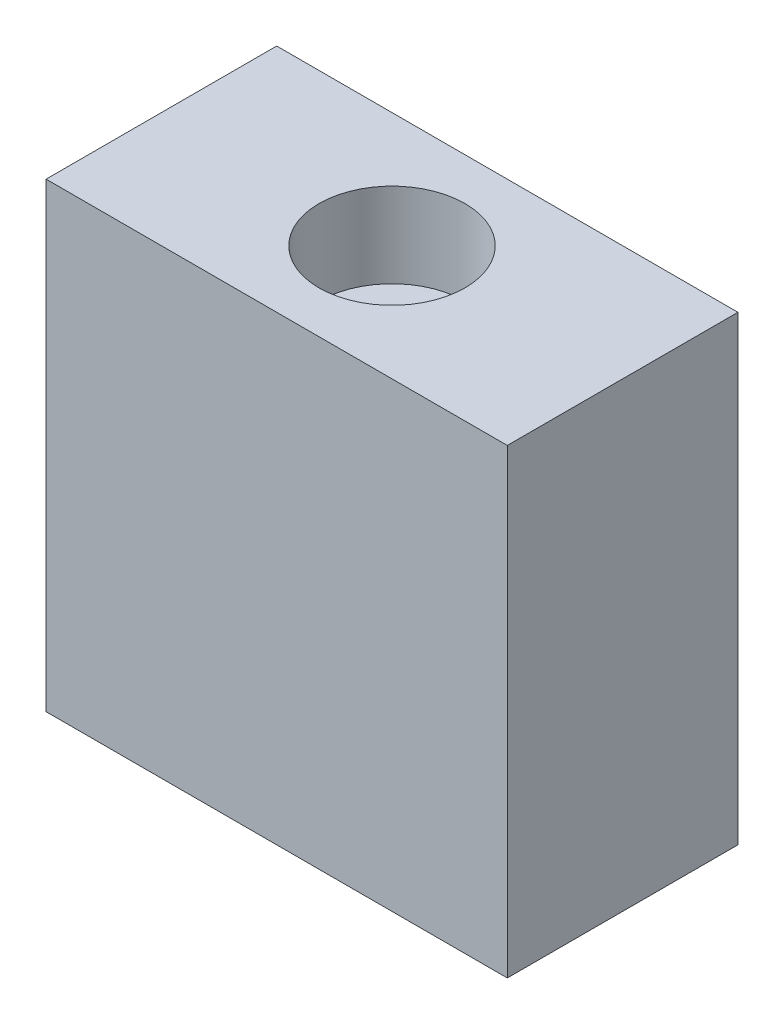
ISO-10303-21;
HEADER;
FILE_DESCRIPTION(('STEP AP214'),'2;1');
FILE_NAME('part.step','',(''),(''),'','','');
FILE_SCHEMA(('AUTOMOTIVE_DESIGN { 1 0 10303 214 1 1 1 1 }'));
ENDSEC;
DATA;
#1=APPLICATION_CONTEXT('core data for automotive mechanical design processes');
#2=APPLICATION_PROTOCOL_DEFINITION('international standard','automotive_design',2000,#1);
#3=PRODUCT_CONTEXT('',#1,'mechanical');
#4=PRODUCT('Part','Part','',(#3));
#5=PRODUCT_RELATED_PRODUCT_CATEGORY('part','',(#4));
#6=PRODUCT_DEFINITION_FORMATION('','',#4);
#7=PRODUCT_DEFINITION_CONTEXT('part definition',#1,'design');
#8=PRODUCT_DEFINITION('design','',#6,#7);
#9=PRODUCT_DEFINITION_SHAPE('','',#8);
#10=(LENGTH_UNIT() NAMED_UNIT(*) SI_UNIT(.MILLI.,.METRE.));
#11=(NAMED_UNIT(*) PLANE_ANGLE_UNIT() SI_UNIT($,.RADIAN.));
#12=(NAMED_UNIT(*) SI_UNIT($,.STERADIAN.) SOLID_ANGLE_UNIT());
#13=UNCERTAINTY_MEASURE_WITH_UNIT(LENGTH_MEASURE(1.E-05),#10,'distance_accuracy_value','');
#14=(GEOMETRIC_REPRESENTATION_CONTEXT(3) GLOBAL_UNCERTAINTY_ASSIGNED_CONTEXT((#13)) GLOBAL_UNIT_ASSIGNED_CONTEXT((#10,
#11,#12)) REPRESENTATION_CONTEXT('',''));
#15=CARTESIAN_POINT('',(0.,0.,0.));
#16=DIRECTION('',(0.,0.,1.));
#17=DIRECTION('',(1.,0.,0.));
#18=AXIS2_PLACEMENT_3D('',#15,#16,#17);
#19=CARTESIAN_POINT('',(0.,-1.2E-05,0.));
#20=DIRECTION('',(0.,1.,0.));
#21=DIRECTION('',(0.,0.,1.));
#22=AXIS2_PLACEMENT_3D('',#19,#20,#21);
#23=CYLINDRICAL_SURFACE('',#22,2.75);
#24=CARTESIAN_POINT('',(0.,0.,0.));
#25=DIRECTION('',(0.,-1.,0.));
#26=DIRECTION('',(0.,0.,-1.));
#27=AXIS2_PLACEMENT_3D('',#24,#25,#26);
#28=CIRCLE('',#27,2.75);
#29=CARTESIAN_POINT('',(0.,0.,2.75));
#30=VERTEX_POINT('',#29);
#31=EDGE_CURVE('E119',#30,#30,#28,.T.);
#32=CARTESIAN_POINT('',(0.,24.5,0.));
#33=DIRECTION('',(0.,1.,0.));
#34=DIRECTION('',(0.,0.,1.));
#35=AXIS2_PLACEMENT_3D('',#32,#33,#34);
#36=CIRCLE('',#35,2.75);
#37=CARTESIAN_POINT('',(0.,24.5,2.75));
#38=VERTEX_POINT('',#37);
#39=EDGE_CURVE('E46',#38,#38,#36,.F.);
#40=CARTESIAN_POINT('',(0.,0.,2.75));
#41=CARTESIAN_POINT('',(0.,0.255208333333333,2.75));
#42=CARTESIAN_POINT('',(0.,0.510416666666667,2.75));
#43=CARTESIAN_POINT('',(0.,1.02083333333333,2.75));
#44=CARTESIAN_POINT('',(0.,1.27604166666667,2.75));
#45=CARTESIAN_POINT('',(0.,1.78645833333333,2.75));
#46=CARTESIAN_POINT('',(0.,2.04166666666667,2.75));
#47=CARTESIAN_POINT('',(0.,2.55208333333333,2.75));
#48=CARTESIAN_POINT('',(0.,2.80729166666667,2.75));
#49=CARTESIAN_POINT('',(0.,3.31770833333333,2.75));
#50=CARTESIAN_POINT('',(0.,3.57291666666667,2.75));
#51=CARTESIAN_POINT('',(0.,4.08333333333333,2.75));
#52=CARTESIAN_POINT('',(0.,4.33854166666667,2.75));
#53=CARTESIAN_POINT('',(0.,4.84895833333333,2.75));
#54=CARTESIAN_POINT('',(0.,5.10416666666667,2.75));
#55=CARTESIAN_POINT('',(0.,5.61458333333333,2.75));
#56=CARTESIAN_POINT('',(0.,5.86979166666667,2.75));
#57=CARTESIAN_POINT('',(0.,6.38020833333333,2.75));
#58=CARTESIAN_POINT('',(0.,6.63541666666667,2.75));
#59=CARTESIAN_POINT('',(0.,7.14583333333333,2.75));
#60=CARTESIAN_POINT('',(0.,7.40104166666667,2.75));
#61=CARTESIAN_POINT('',(0.,7.91145833333333,2.75));
#62=CARTESIAN_POINT('',(0.,8.16666666666667,2.75));
#63=CARTESIAN_POINT('',(0.,8.67708333333333,2.75));
#64=CARTESIAN_POINT('',(0.,8.93229166666667,2.75));
#65=CARTESIAN_POINT('',(0.,9.44270833333333,2.75));
#66=CARTESIAN_POINT('',(0.,9.69791666666667,2.75));
#67=CARTESIAN_POINT('',(0.,10.2083333333333,2.75));
#68=CARTESIAN_POINT('',(0.,10.4635416666667,2.75));
#69=CARTESIAN_POINT('',(0.,10.9739583333333,2.75));
#70=CARTESIAN_POINT('',(0.,11.2291666666667,2.75));
#71=CARTESIAN_POINT('',(0.,11.7395833333333,2.75));
#72=CARTESIAN_POINT('',(0.,11.9947916666667,2.75));
#73=CARTESIAN_POINT('',(0.,12.5052083333333,2.75));
#74=CARTESIAN_POINT('',(0.,12.7604166666667,2.75));
#75=CARTESIAN_POINT('',(0.,13.2708333333333,2.75));
#76=CARTESIAN_POINT('',(0.,13.5260416666667,2.75));
#77=CARTESIAN_POINT('',(0.,14.0364583333333,2.75));
#78=CARTESIAN_POINT('',(0.,14.2916666666667,2.75));
#79=CARTESIAN_POINT('',(0.,14.8020833333333,2.75));
#80=CARTESIAN_POINT('',(0.,15.0572916666667,2.75));
#81=CARTESIAN_POINT('',(0.,15.5677083333333,2.75));
#82=CARTESIAN_POINT('',(0.,15.8229166666667,2.75));
#83=CARTESIAN_POINT('',(0.,16.3333333333333,2.75));
#84=CARTESIAN_POINT('',(0.,16.5885416666667,2.75));
#85=CARTESIAN_POINT('',(0.,17.0989583333333,2.75));
#86=CARTESIAN_POINT('',(0.,17.3541666666667,2.75));
#87=CARTESIAN_POINT('',(0.,17.8645833333333,2.75));
#88=CARTESIAN_POINT('',(0.,18.1197916666667,2.75));
#89=CARTESIAN_POINT('',(0.,18.6302083333333,2.75));
#90=CARTESIAN_POINT('',(0.,18.8854166666667,2.75));
#91=CARTESIAN_POINT('',(0.,19.3958333333333,2.75));
#92=CARTESIAN_POINT('',(0.,19.6510416666667,2.75));
#93=CARTESIAN_POINT('',(0.,20.1614583333333,2.75));
#94=CARTESIAN_POINT('',(0.,20.4166666666667,2.75));
#95=CARTESIAN_POINT('',(0.,20.9270833333333,2.75));
#96=CARTESIAN_POINT('',(0.,21.1822916666667,2.75));
#97=CARTESIAN_POINT('',(0.,21.6927083333333,2.75));
#98=CARTESIAN_POINT('',(0.,21.9479166666667,2.75));
#99=CARTESIAN_POINT('',(0.,22.4583333333333,2.75));
#100=CARTESIAN_POINT('',(0.,22.7135416666667,2.75));
#101=CARTESIAN_POINT('',(0.,23.2239583333333,2.75));
#102=CARTESIAN_POINT('',(0.,23.4791666666667,2.75));
#103=CARTESIAN_POINT('',(0.,23.9895833333333,2.75));
#104=CARTESIAN_POINT('',(0.,24.2447916666667,2.75));
#105=CARTESIAN_POINT('',(0.,24.5,2.75));
#106=B_SPLINE_CURVE_WITH_KNOTS('',3,(#40,#41,#42,#43,#44,#45,#46,#47,#48,#49,#50,#51,#52,#53,
#54,#55,#56,#57,#58,#59,#60,#61,#62,#63,#64,#65,#66,#67,#68,#69,#70,#71,#72,#73,#74,#75,#76,#77,
#78,#79,#80,#81,#82,#83,#84,#85,#86,#87,#88,#89,#90,#91,#92,#93,#94,#95,#96,#97,#98,#99,#100,
#101,#102,#103,#104,#105),.UNSPECIFIED.,.F.,.F.,(4,2,2,2,2,2,2,2,2,2,2,2,2,2,2,2,2,2,2,2,2,2,2,
2,2,2,2,2,2,2,2,2,4),(0.,0.765625,1.53125,2.296875,3.0625,3.828125,4.59375,5.359375,6.125,
6.890625,7.65625,8.421875,9.1875,9.953125,10.71875,11.484375,12.25,13.015625,13.78125,14.546875,
15.3125,16.078125,16.84375,17.609375,18.375,19.140625,19.90625,20.671875,21.4375,22.203125,
22.96875,23.734375,24.5),.UNSPECIFIED.);
#107=EDGE_CURVE('BSEAM42',#30,#38,#106,.T.);
#108=ORIENTED_EDGE('',*,*,#31,.T.);
#109=ORIENTED_EDGE('',*,*,#39,.F.);
#110=ORIENTED_EDGE('',*,*,#107,.T.);
#111=ORIENTED_EDGE('',*,*,#107,.F.);
#112=EDGE_LOOP('',(#108,#110,#109,#111));
#113=FACE_BOUND('',#112,.T.);
#114=ADVANCED_FACE('F42',(#113),#23,.F.);
#115=CARTESIAN_POINT('',(-15.,30.,7.5));
#116=DIRECTION('',(1.,0.,0.));
#117=DIRECTION('',(0.,0.,-1.));
#118=AXIS2_PLACEMENT_3D('',#115,#116,#117);
#119=PLANE('',#118);
#120=DIRECTION('',(0.,0.,1.));
#121=VECTOR('',#120,1.);
#122=CARTESIAN_POINT('',(-15.,0.,7.5));
#123=LINE('',#122,#121);
#124=CARTESIAN_POINT('',(-15.,0.,-7.5));
#125=VERTEX_POINT('',#124);
#126=CARTESIAN_POINT('',(-15.,0.,7.5));
#127=VERTEX_POINT('',#126);
#128=EDGE_CURVE('E115',#125,#127,#123,.T.);
#129=ORIENTED_EDGE('',*,*,#128,.T.);
#130=DIRECTION('',(0.,-1.,0.));
#131=VECTOR('',#130,1.);
#132=CARTESIAN_POINT('',(-15.,30.,7.5));
#133=LINE('',#132,#131);
#134=CARTESIAN_POINT('',(-15.,30.,7.5));
#135=VERTEX_POINT('',#134);
#136=EDGE_CURVE('E11',#135,#127,#133,.T.);
#137=ORIENTED_EDGE('',*,*,#136,.F.);
#138=DIRECTION('',(0.,0.,1.));
#139=VECTOR('',#138,1.);
#140=CARTESIAN_POINT('',(-15.,30.,7.5));
#141=LINE('',#140,#139);
#142=CARTESIAN_POINT('',(-15.,30.,-7.5));
#143=VERTEX_POINT('',#142);
#144=EDGE_CURVE('E97',#143,#135,#141,.T.);
#145=ORIENTED_EDGE('',*,*,#144,.F.);
#146=DIRECTION('',(0.,-1.,0.));
#147=VECTOR('',#146,1.);
#148=CARTESIAN_POINT('',(-15.,30.,-7.5));
#149=LINE('',#148,#147);
#150=EDGE_CURVE('E111',#143,#125,#149,.T.);
#151=ORIENTED_EDGE('',*,*,#150,.T.);
#152=EDGE_LOOP('',(#129,#137,#145,#151));
#153=FACE_BOUND('',#152,.T.);
#154=ADVANCED_FACE('F44',(#153),#119,.F.);
#155=CARTESIAN_POINT('',(-15.,30.,7.5));
#156=DIRECTION('',(0.,0.,-1.));
#157=DIRECTION('',(-1.,0.,0.));
#158=AXIS2_PLACEMENT_3D('',#155,#156,#157);
#159=PLANE('',#158);
#160=DIRECTION('',(1.,0.,0.));
#161=VECTOR('',#160,1.);
#162=CARTESIAN_POINT('',(-15.,0.,7.5));
#163=LINE('',#162,#161);
#164=CARTESIAN_POINT('',(15.,0.,7.5));
#165=VERTEX_POINT('',#164);
#166=EDGE_CURVE('E102',#127,#165,#163,.T.);
#167=ORIENTED_EDGE('',*,*,#166,.T.);
#168=DIRECTION('',(0.,-1.,0.));
#169=VECTOR('',#168,1.);
#170=CARTESIAN_POINT('',(15.,30.,7.5));
#171=LINE('',#170,#169);
#172=CARTESIAN_POINT('',(15.,30.,7.5));
#173=VERTEX_POINT('',#172);
#174=EDGE_CURVE('E53',#173,#165,#171,.T.);
#175=ORIENTED_EDGE('',*,*,#174,.F.);
#176=DIRECTION('',(1.,0.,0.));
#177=VECTOR('',#176,1.);
#178=CARTESIAN_POINT('',(-15.,30.,7.5));
#179=LINE('',#178,#177);
#180=EDGE_CURVE('E92',#135,#173,#179,.T.);
#181=ORIENTED_EDGE('',*,*,#180,.F.);
#182=ORIENTED_EDGE('',*,*,#136,.T.);
#183=EDGE_LOOP('',(#167,#175,#181,#182));
#184=FACE_BOUND('',#183,.T.);
#185=ADVANCED_FACE('F101',(#184),#159,.F.);
#186=CARTESIAN_POINT('',(15.,30.,7.5));
#187=DIRECTION('',(-1.,0.,0.));
#188=DIRECTION('',(0.,0.,1.));
#189=AXIS2_PLACEMENT_3D('',#186,#187,#188);
#190=PLANE('',#189);
#191=DIRECTION('',(0.,0.,-1.));
#192=VECTOR('',#191,1.);
#193=CARTESIAN_POINT('',(15.,0.,7.5));
#194=LINE('',#193,#192);
#195=CARTESIAN_POINT('',(15.,0.,-7.5));
#196=VERTEX_POINT('',#195);
#197=EDGE_CURVE('E79',#165,#196,#194,.T.);
#198=ORIENTED_EDGE('',*,*,#197,.T.);
#199=DIRECTION('',(0.,-1.,0.));
#200=VECTOR('',#199,1.);
#201=CARTESIAN_POINT('',(15.,30.,-7.5));
#202=LINE('',#201,#200);
#203=CARTESIAN_POINT('',(15.,30.,-7.5));
#204=VERTEX_POINT('',#203);
#205=EDGE_CURVE('E104',#204,#196,#202,.T.);
#206=ORIENTED_EDGE('',*,*,#205,.F.);
#207=DIRECTION('',(0.,0.,-1.));
#208=VECTOR('',#207,1.);
#209=CARTESIAN_POINT('',(15.,30.,7.5));
#210=LINE('',#209,#208);
#211=EDGE_CURVE('E95',#173,#204,#210,.T.);
#212=ORIENTED_EDGE('',*,*,#211,.F.);
#213=ORIENTED_EDGE('',*,*,#174,.T.);
#214=EDGE_LOOP('',(#198,#206,#212,#213));
#215=FACE_BOUND('',#214,.T.);
#216=ADVANCED_FACE('F106',(#215),#190,.F.);
#217=CARTESIAN_POINT('',(-15.,30.,-7.5));
#218=DIRECTION('',(0.,0.,1.));
#219=DIRECTION('',(1.,0.,0.));
#220=AXIS2_PLACEMENT_3D('',#217,#218,#219);
#221=PLANE('',#220);
#222=DIRECTION('',(-1.,0.,0.));
#223=VECTOR('',#222,1.);
#224=CARTESIAN_POINT('',(-15.,0.,-7.5));
#225=LINE('',#224,#223);
#226=EDGE_CURVE('E85',#196,#125,#225,.T.);
#227=ORIENTED_EDGE('',*,*,#226,.T.);
#228=ORIENTED_EDGE('',*,*,#150,.F.);
#229=DIRECTION('',(-1.,0.,0.));
#230=VECTOR('',#229,1.);
#231=CARTESIAN_POINT('',(-15.,30.,-7.5));
#232=LINE('',#231,#230);
#233=EDGE_CURVE('E62',#204,#143,#232,.T.);
#234=ORIENTED_EDGE('',*,*,#233,.F.);
#235=ORIENTED_EDGE('',*,*,#205,.T.);
#236=EDGE_LOOP('',(#227,#228,#234,#235));
#237=FACE_BOUND('',#236,.T.);
#238=ADVANCED_FACE('F164',(#237),#221,.F.);
#239=CARTESIAN_POINT('',(0.,30.,0.));
#240=DIRECTION('',(0.,-1.,0.));
#241=DIRECTION('',(0.,0.,-1.));
#242=AXIS2_PLACEMENT_3D('',#239,#240,#241);
#243=PLANE('',#242);
#244=CARTESIAN_POINT('',(0.,30.,0.));
#245=DIRECTION('',(0.,1.,0.));
#246=DIRECTION('',(0.,0.,1.));
#247=AXIS2_PLACEMENT_3D('',#244,#245,#246);
#248=CIRCLE('',#247,4.75);
#249=CARTESIAN_POINT('',(0.,30.,4.75));
#250=VERTEX_POINT('',#249);
#251=EDGE_CURVE('E142',#250,#250,#248,.T.);
#252=ORIENTED_EDGE('',*,*,#251,.F.);
#253=EDGE_LOOP('',(#252));
#254=FACE_BOUND('',#253,.T.);
#255=ORIENTED_EDGE('',*,*,#144,.T.);
#256=ORIENTED_EDGE('',*,*,#180,.T.);
#257=ORIENTED_EDGE('',*,*,#211,.T.);
#258=ORIENTED_EDGE('',*,*,#233,.T.);
#259=EDGE_LOOP('',(#255,#256,#257,#258));
#260=FACE_BOUND('',#259,.T.);
#261=ADVANCED_FACE('F93',(#254,#260),#243,.F.);
#262=CARTESIAN_POINT('',(0.,0.,0.));
#263=DIRECTION('',(0.,-1.,0.));
#264=DIRECTION('',(0.,0.,-1.));
#265=AXIS2_PLACEMENT_3D('',#262,#263,#264);
#266=PLANE('',#265);
#267=ORIENTED_EDGE('',*,*,#31,.F.);
#268=EDGE_LOOP('',(#267));
#269=FACE_BOUND('',#268,.T.);
#270=ORIENTED_EDGE('',*,*,#128,.F.);
#271=ORIENTED_EDGE('',*,*,#226,.F.);
#272=ORIENTED_EDGE('',*,*,#197,.F.);
#273=ORIENTED_EDGE('',*,*,#166,.F.);
#274=EDGE_LOOP('',(#270,#271,#272,#273));
#275=FACE_BOUND('',#274,.T.);
#276=ADVANCED_FACE('F163',(#269,#275),#266,.T.);
#277=CARTESIAN_POINT('',(0.,24.5,0.));
#278=DIRECTION('',(0.,1.,0.));
#279=DIRECTION('',(0.,0.,1.));
#280=AXIS2_PLACEMENT_3D('',#277,#278,#279);
#281=PLANE('',#280);
#282=CARTESIAN_POINT('',(0.,24.5,0.));
#283=DIRECTION('',(0.,1.,0.));
#284=DIRECTION('',(0.,0.,1.));
#285=AXIS2_PLACEMENT_3D('',#282,#283,#284);
#286=CIRCLE('',#285,4.75);
#287=CARTESIAN_POINT('',(0.,24.5,4.75));
#288=VERTEX_POINT('',#287);
#289=EDGE_CURVE('E136',#288,#288,#286,.T.);
#290=ORIENTED_EDGE('',*,*,#289,.T.);
#291=EDGE_LOOP('',(#290));
#292=FACE_BOUND('',#291,.T.);
#293=ORIENTED_EDGE('',*,*,#39,.T.);
#294=EDGE_LOOP('',(#293));
#295=FACE_BOUND('',#294,.T.);
#296=ADVANCED_FACE('F171',(#292,#295),#281,.T.);
#297=CARTESIAN_POINT('',(0.,24.5,0.));
#298=DIRECTION('',(0.,1.,0.));
#299=DIRECTION('',(0.,0.,1.));
#300=AXIS2_PLACEMENT_3D('',#297,#298,#299);
#301=CYLINDRICAL_SURFACE('',#300,4.75);
#302=ORIENTED_EDGE('',*,*,#289,.F.);
#303=EDGE_LOOP('',(#302));
#304=FACE_BOUND('',#303,.T.);
#305=ORIENTED_EDGE('',*,*,#251,.T.);
#306=EDGE_LOOP('',(#305));
#307=FACE_BOUND('',#306,.T.);
#308=ADVANCED_FACE('F160',(#304,#307),#301,.F.);
#309=CLOSED_SHELL('',(#114,#154,#185,#216,#238,#261,#276,#296,#308));
#310=MANIFOLD_SOLID_BREP('B2',#309);
#311=ADVANCED_BREP_SHAPE_REPRESENTATION('',(#18,#310),#14);
#312=SHAPE_DEFINITION_REPRESENTATION(#9,#311);
ENDSEC;
END-ISO-10303-21;
